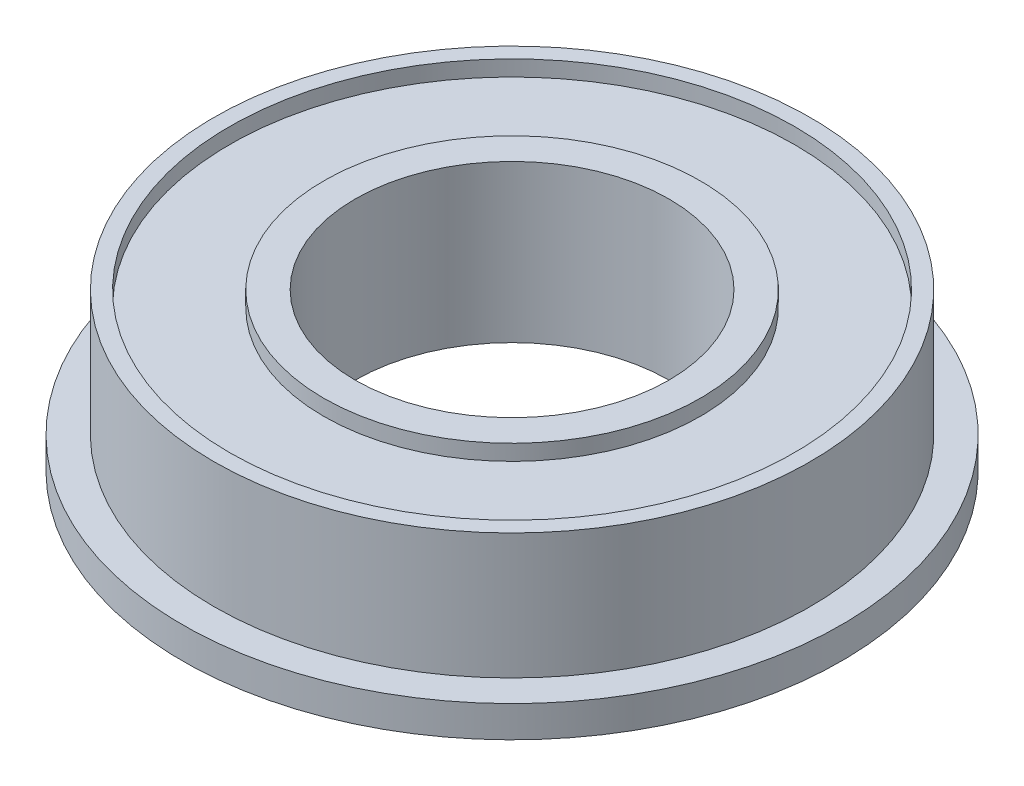
ISO-10303-21;
HEADER;
FILE_DESCRIPTION(('STEP AP214'),'2;1');
FILE_NAME('part.step','',(''),(''),'','','');
FILE_SCHEMA(('AUTOMOTIVE_DESIGN { 1 0 10303 214 1 1 1 1 }'));
ENDSEC;
DATA;
#1=APPLICATION_CONTEXT('core data for automotive mechanical design processes');
#2=APPLICATION_PROTOCOL_DEFINITION('international standard','automotive_design',2000,#1);
#3=PRODUCT_CONTEXT('',#1,'mechanical');
#4=PRODUCT('Part','Part','',(#3));
#5=PRODUCT_RELATED_PRODUCT_CATEGORY('part','',(#4));
#6=PRODUCT_DEFINITION_FORMATION('','',#4);
#7=PRODUCT_DEFINITION_CONTEXT('part definition',#1,'design');
#8=PRODUCT_DEFINITION('design','',#6,#7);
#9=PRODUCT_DEFINITION_SHAPE('','',#8);
#10=(LENGTH_UNIT() NAMED_UNIT(*) SI_UNIT(.MILLI.,.METRE.));
#11=(NAMED_UNIT(*) PLANE_ANGLE_UNIT() SI_UNIT($,.RADIAN.));
#12=(NAMED_UNIT(*) SI_UNIT($,.STERADIAN.) SOLID_ANGLE_UNIT());
#13=UNCERTAINTY_MEASURE_WITH_UNIT(LENGTH_MEASURE(1.E-05),#10,'distance_accuracy_value','');
#14=(GEOMETRIC_REPRESENTATION_CONTEXT(3) GLOBAL_UNCERTAINTY_ASSIGNED_CONTEXT((#13)) GLOBAL_UNIT_ASSIGNED_CONTEXT((#10,
#11,#12)) REPRESENTATION_CONTEXT('',''));
#15=CARTESIAN_POINT('',(0.,0.,0.));
#16=DIRECTION('',(0.,0.,1.));
#17=DIRECTION('',(1.,0.,0.));
#18=AXIS2_PLACEMENT_3D('',#15,#16,#17);
#19=CARTESIAN_POINT('',(0.,-1.,0.));
#20=DIRECTION('',(0.,-1.,0.));
#21=DIRECTION('',(0.,0.,-1.));
#22=AXIS2_PLACEMENT_3D('',#19,#20,#21);
#23=PLANE('',#22);
#24=CARTESIAN_POINT('',(0.,-1.,0.));
#25=DIRECTION('',(0.,-1.,0.));
#26=DIRECTION('',(0.,0.,-1.));
#27=AXIS2_PLACEMENT_3D('',#24,#25,#26);
#28=CIRCLE('',#27,5.);
#29=CARTESIAN_POINT('',(0.,-1.,-5.));
#30=VERTEX_POINT('',#29);
#31=EDGE_CURVE('E58',#30,#30,#28,.F.);
#32=ORIENTED_EDGE('',*,*,#31,.T.);
#33=EDGE_LOOP('',(#32));
#34=FACE_BOUND('',#33,.T.);
#35=CARTESIAN_POINT('',(0.,-1.,0.));
#36=DIRECTION('',(0.,-1.,0.));
#37=DIRECTION('',(0.,0.,-1.));
#38=AXIS2_PLACEMENT_3D('',#35,#36,#37);
#39=CIRCLE('',#38,6.);
#40=CARTESIAN_POINT('',(0.,-1.,-6.));
#41=VERTEX_POINT('',#40);
#42=EDGE_CURVE('E82',#41,#41,#39,.T.);
#43=ORIENTED_EDGE('',*,*,#42,.T.);
#44=EDGE_LOOP('',(#43));
#45=FACE_BOUND('',#44,.T.);
#46=ADVANCED_FACE('F39',(#34,#45),#23,.T.);
#47=CARTESIAN_POINT('',(0.,4.,0.));
#48=DIRECTION('',(0.,1.,0.));
#49=DIRECTION('',(0.,0.,1.));
#50=AXIS2_PLACEMENT_3D('',#47,#48,#49);
#51=PLANE('',#50);
#52=CARTESIAN_POINT('',(0.,4.,0.));
#53=DIRECTION('',(0.,1.,0.));
#54=DIRECTION('',(0.,0.,1.));
#55=AXIS2_PLACEMENT_3D('',#52,#53,#54);
#56=CIRCLE('',#55,5.);
#57=CARTESIAN_POINT('',(0.,4.,5.));
#58=VERTEX_POINT('',#57);
#59=EDGE_CURVE('E55',#58,#58,#56,.T.);
#60=ORIENTED_EDGE('',*,*,#59,.F.);
#61=EDGE_LOOP('',(#60));
#62=FACE_BOUND('',#61,.T.);
#63=CARTESIAN_POINT('',(0.,4.,0.));
#64=DIRECTION('',(0.,1.,0.));
#65=DIRECTION('',(0.,0.,1.));
#66=AXIS2_PLACEMENT_3D('',#63,#64,#65);
#67=CIRCLE('',#66,6.);
#68=CARTESIAN_POINT('',(0.,4.,6.));
#69=VERTEX_POINT('',#68);
#70=EDGE_CURVE('E70',#69,#69,#67,.T.);
#71=ORIENTED_EDGE('',*,*,#70,.T.);
#72=EDGE_LOOP('',(#71));
#73=FACE_BOUND('',#72,.T.);
#74=ADVANCED_FACE('F130',(#62,#73),#51,.T.);
#75=CARTESIAN_POINT('',(0.,4.,0.));
#76=DIRECTION('',(0.,-1.,0.));
#77=DIRECTION('',(0.,0.,-1.));
#78=AXIS2_PLACEMENT_3D('',#75,#76,#77);
#79=CYLINDRICAL_SURFACE('',#78,9.5);
#80=CARTESIAN_POINT('',(0.,4.,0.));
#81=DIRECTION('',(0.,1.,0.));
#82=DIRECTION('',(0.,0.,1.));
#83=AXIS2_PLACEMENT_3D('',#80,#81,#82);
#84=CIRCLE('',#83,9.5);
#85=CARTESIAN_POINT('',(0.,4.,9.5));
#86=VERTEX_POINT('',#85);
#87=EDGE_CURVE('E10',#86,#86,#84,.T.);
#88=ORIENTED_EDGE('',*,*,#87,.F.);
#89=EDGE_LOOP('',(#88));
#90=FACE_BOUND('',#89,.T.);
#91=CARTESIAN_POINT('',(0.,0.,0.));
#92=DIRECTION('',(0.,1.,0.));
#93=DIRECTION('',(0.,0.,1.));
#94=AXIS2_PLACEMENT_3D('',#91,#92,#93);
#95=CIRCLE('',#94,9.5);
#96=CARTESIAN_POINT('',(0.,0.,9.5));
#97=VERTEX_POINT('',#96);
#98=EDGE_CURVE('E43',#97,#97,#95,.T.);
#99=ORIENTED_EDGE('',*,*,#98,.T.);
#100=EDGE_LOOP('',(#99));
#101=FACE_BOUND('',#100,.T.);
#102=ADVANCED_FACE('F41',(#90,#101),#79,.T.);
#103=CARTESIAN_POINT('',(0.,4.,0.));
#104=DIRECTION('',(0.,1.,0.));
#105=DIRECTION('',(0.,0.,1.));
#106=AXIS2_PLACEMENT_3D('',#103,#104,#105);
#107=CIRCLE('',#106,9.);
#108=CARTESIAN_POINT('',(0.,4.,9.));
#109=VERTEX_POINT('',#108);
#110=EDGE_CURVE('E64',#109,#109,#107,.T.);
#111=ORIENTED_EDGE('',*,*,#110,.F.);
#112=EDGE_LOOP('',(#111));
#113=FACE_BOUND('',#112,.T.);
#114=ORIENTED_EDGE('',*,*,#87,.T.);
#115=EDGE_LOOP('',(#114));
#116=FACE_BOUND('',#115,.T.);
#117=ADVANCED_FACE('F114',(#113,#116),#51,.T.);
#118=CARTESIAN_POINT('',(0.,-1.,0.));
#119=DIRECTION('',(0.,1.,0.));
#120=DIRECTION('',(0.,0.,1.));
#121=AXIS2_PLACEMENT_3D('',#118,#119,#120);
#122=CYLINDRICAL_SURFACE('',#121,10.5);
#123=CARTESIAN_POINT('',(0.,-1.,0.));
#124=DIRECTION('',(0.,-1.,0.));
#125=DIRECTION('',(0.,0.,-1.));
#126=AXIS2_PLACEMENT_3D('',#123,#124,#125);
#127=CIRCLE('',#126,10.5);
#128=CARTESIAN_POINT('',(0.,-1.,-10.5));
#129=VERTEX_POINT('',#128);
#130=EDGE_CURVE('E50',#129,#129,#127,.T.);
#131=ORIENTED_EDGE('',*,*,#130,.F.);
#132=EDGE_LOOP('',(#131));
#133=FACE_BOUND('',#132,.T.);
#134=CARTESIAN_POINT('',(0.,0.,0.));
#135=DIRECTION('',(0.,-1.,0.));
#136=DIRECTION('',(0.,0.,-1.));
#137=AXIS2_PLACEMENT_3D('',#134,#135,#136);
#138=CIRCLE('',#137,10.5);
#139=CARTESIAN_POINT('',(0.,0.,-10.5));
#140=VERTEX_POINT('',#139);
#141=EDGE_CURVE('E52',#140,#140,#138,.T.);
#142=ORIENTED_EDGE('',*,*,#141,.T.);
#143=EDGE_LOOP('',(#142));
#144=FACE_BOUND('',#143,.T.);
#145=ADVANCED_FACE('F108',(#133,#144),#122,.T.);
#146=CARTESIAN_POINT('',(0.,-1.,0.));
#147=DIRECTION('',(0.,-1.,0.));
#148=DIRECTION('',(0.,0.,-1.));
#149=AXIS2_PLACEMENT_3D('',#146,#147,#148);
#150=CIRCLE('',#149,9.);
#151=CARTESIAN_POINT('',(0.,-1.,-9.));
#152=VERTEX_POINT('',#151);
#153=EDGE_CURVE('E76',#152,#152,#150,.T.);
#154=ORIENTED_EDGE('',*,*,#153,.F.);
#155=EDGE_LOOP('',(#154));
#156=FACE_BOUND('',#155,.T.);
#157=ORIENTED_EDGE('',*,*,#130,.T.);
#158=EDGE_LOOP('',(#157));
#159=FACE_BOUND('',#158,.T.);
#160=ADVANCED_FACE('F104',(#156,#159),#23,.T.);
#161=CARTESIAN_POINT('',(0.,0.,0.));
#162=DIRECTION('',(0.,-1.,0.));
#163=DIRECTION('',(0.,0.,-1.));
#164=AXIS2_PLACEMENT_3D('',#161,#162,#163);
#165=PLANE('',#164);
#166=ORIENTED_EDGE('',*,*,#98,.F.);
#167=EDGE_LOOP('',(#166));
#168=FACE_BOUND('',#167,.T.);
#169=ORIENTED_EDGE('',*,*,#141,.F.);
#170=EDGE_LOOP('',(#169));
#171=FACE_BOUND('',#170,.T.);
#172=ADVANCED_FACE('F107',(#168,#171),#165,.F.);
#173=CARTESIAN_POINT('',(0.,-1.001,0.));
#174=DIRECTION('',(0.,1.,0.));
#175=DIRECTION('',(0.,0.,1.));
#176=AXIS2_PLACEMENT_3D('',#173,#174,#175);
#177=CYLINDRICAL_SURFACE('',#176,5.);
#178=ORIENTED_EDGE('',*,*,#31,.F.);
#179=EDGE_LOOP('',(#178));
#180=FACE_BOUND('',#179,.T.);
#181=ORIENTED_EDGE('',*,*,#59,.T.);
#182=EDGE_LOOP('',(#181));
#183=FACE_BOUND('',#182,.T.);
#184=ADVANCED_FACE('F119',(#180,#183),#177,.F.);
#185=CARTESIAN_POINT('',(0.,3.5,0.));
#186=DIRECTION('',(0.,1.,0.));
#187=DIRECTION('',(0.,0.,1.));
#188=AXIS2_PLACEMENT_3D('',#185,#186,#187);
#189=CYLINDRICAL_SURFACE('',#188,9.);
#190=CARTESIAN_POINT('',(0.,3.5,0.));
#191=DIRECTION('',(0.,1.,0.));
#192=DIRECTION('',(0.,0.,1.));
#193=AXIS2_PLACEMENT_3D('',#190,#191,#192);
#194=CIRCLE('',#193,9.);
#195=CARTESIAN_POINT('',(0.,3.5,9.));
#196=VERTEX_POINT('',#195);
#197=EDGE_CURVE('E61',#196,#196,#194,.T.);
#198=ORIENTED_EDGE('',*,*,#197,.F.);
#199=EDGE_LOOP('',(#198));
#200=FACE_BOUND('',#199,.T.);
#201=ORIENTED_EDGE('',*,*,#110,.T.);
#202=EDGE_LOOP('',(#201));
#203=FACE_BOUND('',#202,.T.);
#204=ADVANCED_FACE('F125',(#200,#203),#189,.F.);
#205=CARTESIAN_POINT('',(0.,3.5,0.));
#206=DIRECTION('',(0.,1.,0.));
#207=DIRECTION('',(0.,0.,1.));
#208=AXIS2_PLACEMENT_3D('',#205,#206,#207);
#209=PLANE('',#208);
#210=CARTESIAN_POINT('',(0.,3.5,0.));
#211=DIRECTION('',(0.,1.,0.));
#212=DIRECTION('',(0.,0.,1.));
#213=AXIS2_PLACEMENT_3D('',#210,#211,#212);
#214=CIRCLE('',#213,6.);
#215=CARTESIAN_POINT('',(0.,3.5,6.));
#216=VERTEX_POINT('',#215);
#217=EDGE_CURVE('E67',#216,#216,#214,.T.);
#218=ORIENTED_EDGE('',*,*,#217,.F.);
#219=EDGE_LOOP('',(#218));
#220=FACE_BOUND('',#219,.T.);
#221=ORIENTED_EDGE('',*,*,#197,.T.);
#222=EDGE_LOOP('',(#221));
#223=FACE_BOUND('',#222,.T.);
#224=ADVANCED_FACE('F141',(#220,#223),#209,.T.);
#225=CARTESIAN_POINT('',(0.,3.5,0.));
#226=DIRECTION('',(0.,1.,0.));
#227=DIRECTION('',(0.,0.,1.));
#228=AXIS2_PLACEMENT_3D('',#225,#226,#227);
#229=CYLINDRICAL_SURFACE('',#228,6.);
#230=ORIENTED_EDGE('',*,*,#217,.T.);
#231=EDGE_LOOP('',(#230));
#232=FACE_BOUND('',#231,.T.);
#233=ORIENTED_EDGE('',*,*,#70,.F.);
#234=EDGE_LOOP('',(#233));
#235=FACE_BOUND('',#234,.T.);
#236=ADVANCED_FACE('F100',(#232,#235),#229,.T.);
#237=CARTESIAN_POINT('',(0.,-0.5,0.));
#238=DIRECTION('',(0.,-1.,0.));
#239=DIRECTION('',(0.,0.,-1.));
#240=AXIS2_PLACEMENT_3D('',#237,#238,#239);
#241=CYLINDRICAL_SURFACE('',#240,9.);
#242=CARTESIAN_POINT('',(0.,-0.5,0.));
#243=DIRECTION('',(0.,-1.,0.));
#244=DIRECTION('',(0.,0.,-1.));
#245=AXIS2_PLACEMENT_3D('',#242,#243,#244);
#246=CIRCLE('',#245,9.);
#247=CARTESIAN_POINT('',(0.,-0.5,-9.));
#248=VERTEX_POINT('',#247);
#249=EDGE_CURVE('E73',#248,#248,#246,.T.);
#250=ORIENTED_EDGE('',*,*,#249,.F.);
#251=EDGE_LOOP('',(#250));
#252=FACE_BOUND('',#251,.T.);
#253=ORIENTED_EDGE('',*,*,#153,.T.);
#254=EDGE_LOOP('',(#253));
#255=FACE_BOUND('',#254,.T.);
#256=ADVANCED_FACE('F94',(#252,#255),#241,.F.);
#257=CARTESIAN_POINT('',(0.,-0.5,0.));
#258=DIRECTION('',(0.,-1.,0.));
#259=DIRECTION('',(0.,0.,-1.));
#260=AXIS2_PLACEMENT_3D('',#257,#258,#259);
#261=PLANE('',#260);
#262=CARTESIAN_POINT('',(0.,-0.5,0.));
#263=DIRECTION('',(0.,-1.,0.));
#264=DIRECTION('',(0.,0.,-1.));
#265=AXIS2_PLACEMENT_3D('',#262,#263,#264);
#266=CIRCLE('',#265,6.);
#267=CARTESIAN_POINT('',(0.,-0.5,-6.));
#268=VERTEX_POINT('',#267);
#269=EDGE_CURVE('E79',#268,#268,#266,.T.);
#270=ORIENTED_EDGE('',*,*,#269,.F.);
#271=EDGE_LOOP('',(#270));
#272=FACE_BOUND('',#271,.T.);
#273=ORIENTED_EDGE('',*,*,#249,.T.);
#274=EDGE_LOOP('',(#273));
#275=FACE_BOUND('',#274,.T.);
#276=ADVANCED_FACE('F91',(#272,#275),#261,.T.);
#277=CARTESIAN_POINT('',(0.,-0.5,0.));
#278=DIRECTION('',(0.,-1.,0.));
#279=DIRECTION('',(0.,0.,-1.));
#280=AXIS2_PLACEMENT_3D('',#277,#278,#279);
#281=CYLINDRICAL_SURFACE('',#280,6.);
#282=ORIENTED_EDGE('',*,*,#269,.T.);
#283=EDGE_LOOP('',(#282));
#284=FACE_BOUND('',#283,.T.);
#285=ORIENTED_EDGE('',*,*,#42,.F.);
#286=EDGE_LOOP('',(#285));
#287=FACE_BOUND('',#286,.T.);
#288=ADVANCED_FACE('F88',(#284,#287),#281,.T.);
#289=CLOSED_SHELL('',(#46,#74,#102,#117,#145,#160,#172,#184,#204,#224,#236,#256,#276,#288));
#290=MANIFOLD_SOLID_BREP('B2',#289);
#291=ADVANCED_BREP_SHAPE_REPRESENTATION('',(#18,#290),#14);
#292=SHAPE_DEFINITION_REPRESENTATION(#9,#291);
ENDSEC;
END-ISO-10303-21;
